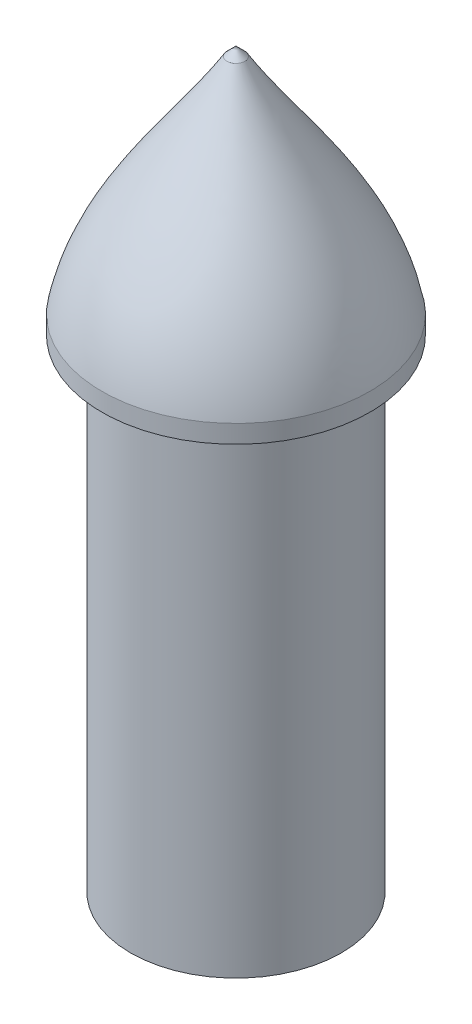
ISO-10303-21;
HEADER;
FILE_DESCRIPTION(('STEP AP214'),'2;1');
FILE_NAME('part.step','',(''),(''),'','','');
FILE_SCHEMA(('AUTOMOTIVE_DESIGN { 1 0 10303 214 1 1 1 1 }'));
ENDSEC;
DATA;
#1=APPLICATION_CONTEXT('core data for automotive mechanical design processes');
#2=APPLICATION_PROTOCOL_DEFINITION('international standard','automotive_design',2000,#1);
#3=PRODUCT_CONTEXT('',#1,'mechanical');
#4=PRODUCT('Part','Part','',(#3));
#5=PRODUCT_RELATED_PRODUCT_CATEGORY('part','',(#4));
#6=PRODUCT_DEFINITION_FORMATION('','',#4);
#7=PRODUCT_DEFINITION_CONTEXT('part definition',#1,'design');
#8=PRODUCT_DEFINITION('design','',#6,#7);
#9=PRODUCT_DEFINITION_SHAPE('','',#8);
#10=(LENGTH_UNIT() NAMED_UNIT(*) SI_UNIT(.MILLI.,.METRE.));
#11=(NAMED_UNIT(*) PLANE_ANGLE_UNIT() SI_UNIT($,.RADIAN.));
#12=(NAMED_UNIT(*) SI_UNIT($,.STERADIAN.) SOLID_ANGLE_UNIT());
#13=UNCERTAINTY_MEASURE_WITH_UNIT(LENGTH_MEASURE(1.E-05),#10,'distance_accuracy_value','');
#14=(GEOMETRIC_REPRESENTATION_CONTEXT(3) GLOBAL_UNCERTAINTY_ASSIGNED_CONTEXT((#13)) GLOBAL_UNIT_ASSIGNED_CONTEXT((#10,
#11,#12)) REPRESENTATION_CONTEXT('',''));
#15=CARTESIAN_POINT('',(0.,0.,0.));
#16=DIRECTION('',(0.,0.,1.));
#17=DIRECTION('',(1.,0.,0.));
#18=AXIS2_PLACEMENT_3D('',#15,#16,#17);
#19=CARTESIAN_POINT('',(-2.,0.,0.));
#20=DIRECTION('',(0.,1.,0.));
#21=DIRECTION('',(0.,0.,1.));
#22=AXIS2_PLACEMENT_3D('',#19,#20,#21);
#23=PLANE('',#22);
#24=CARTESIAN_POINT('',(0.,0.,0.));
#25=DIRECTION('',(0.,1.,0.));
#26=DIRECTION('',(0.,0.,1.));
#27=AXIS2_PLACEMENT_3D('',#24,#25,#26);
#28=CIRCLE('',#27,3.45);
#29=CARTESIAN_POINT('',(0.,0.,3.45));
#30=VERTEX_POINT('',#29);
#31=EDGE_CURVE('E11',#30,#30,#28,.T.);
#32=ORIENTED_EDGE('',*,*,#31,.T.);
#33=EDGE_LOOP('',(#32));
#34=FACE_BOUND('',#33,.T.);
#35=CARTESIAN_POINT('',(0.,0.,0.));
#36=DIRECTION('',(0.,-1.,0.));
#37=DIRECTION('',(0.,0.,-1.));
#38=AXIS2_PLACEMENT_3D('',#35,#36,#37);
#39=CIRCLE('',#38,3.75);
#40=CARTESIAN_POINT('',(0.,0.,-3.75));
#41=VERTEX_POINT('',#40);
#42=EDGE_CURVE('E56',#41,#41,#39,.T.);
#43=ORIENTED_EDGE('',*,*,#42,.T.);
#44=EDGE_LOOP('',(#43));
#45=FACE_BOUND('',#44,.T.);
#46=ADVANCED_FACE('F32',(#34,#45),#23,.F.);
#47=CARTESIAN_POINT('',(0.,7.,0.));
#48=DIRECTION('',(0.,-1.,0.));
#49=DIRECTION('',(0.,0.,-1.));
#50=AXIS2_PLACEMENT_3D('',#47,#48,#49);
#51=CONICAL_SURFACE('',#50,0.,0.785398163397438);
#52=CARTESIAN_POINT('',(0.,6.75257649370923,0.));
#53=DIRECTION('',(0.,-1.,0.));
#54=DIRECTION('',(0.,0.,-1.));
#55=AXIS2_PLACEMENT_3D('',#52,#53,#54);
#56=CIRCLE('',#55,0.247423506290761);
#57=CARTESIAN_POINT('',(0.,6.75257649370923,-0.247423506290761));
#58=VERTEX_POINT('',#57);
#59=EDGE_CURVE('E101',#58,#58,#56,.T.);
#60=ORIENTED_EDGE('',*,*,#59,.F.);
#61=EDGE_LOOP('',(#60));
#62=FACE_BOUND('',#61,.T.);
#63=CARTESIAN_POINT('',(0.,7.,0.));
#64=VERTEX_POINT('',#63);
#65=VERTEX_LOOP('',#64);
#66=FACE_BOUND('',#65,.T.);
#67=ADVANCED_FACE('F85',(#62,#66),#51,.T.);
#68=CARTESIAN_POINT('',(-0.247423506290761,6.75257649370924,0.));
#69=CARTESIAN_POINT('',(-1.47977646656717,4.70886286145873,0.));
#70=CARTESIAN_POINT('',(-3.28291831914856,2.94887927020943,0.));
#71=CARTESIAN_POINT('',(-3.75,0.506327417075365,0.));
#72=B_SPLINE_CURVE_WITH_KNOTS('',3,(#68,#69,#70,#71),.UNSPECIFIED.,.F.,.F.,(4,4),(0.,1.),.UNSPECIFIED.);
#73=CARTESIAN_POINT('',(0.,-2.,0.));
#74=DIRECTION('',(0.,-1.,0.));
#75=AXIS1_PLACEMENT('',#73,#74);
#76=SURFACE_OF_REVOLUTION('',#72,#75);
#77=CARTESIAN_POINT('',(0.,0.506327417075365,0.));
#78=DIRECTION('',(0.,-1.,0.));
#79=DIRECTION('',(0.,0.,-1.));
#80=AXIS2_PLACEMENT_3D('',#77,#78,#79);
#81=CIRCLE('',#80,3.75);
#82=CARTESIAN_POINT('',(0.,0.506327417075365,-3.75));
#83=VERTEX_POINT('',#82);
#84=EDGE_CURVE('E60',#83,#83,#81,.T.);
#85=ORIENTED_EDGE('',*,*,#84,.F.);
#86=EDGE_LOOP('',(#85));
#87=FACE_BOUND('',#86,.T.);
#88=ORIENTED_EDGE('',*,*,#59,.T.);
#89=EDGE_LOOP('',(#88));
#90=FACE_BOUND('',#89,.T.);
#91=ADVANCED_FACE('F91',(#87,#90),#76,.T.);
#92=CARTESIAN_POINT('',(0.,-2.,0.));
#93=DIRECTION('',(0.,-1.,0.));
#94=DIRECTION('',(0.,0.,-1.));
#95=AXIS2_PLACEMENT_3D('',#92,#93,#94);
#96=CYLINDRICAL_SURFACE('',#95,3.75);
#97=ORIENTED_EDGE('',*,*,#42,.F.);
#98=EDGE_LOOP('',(#97));
#99=FACE_BOUND('',#98,.T.);
#100=ORIENTED_EDGE('',*,*,#84,.T.);
#101=EDGE_LOOP('',(#100));
#102=FACE_BOUND('',#101,.T.);
#103=ADVANCED_FACE('F87',(#99,#102),#96,.T.);
#104=CARTESIAN_POINT('',(0.,-13.5,0.));
#105=DIRECTION('',(0.,-1.,0.));
#106=DIRECTION('',(0.,0.,-1.));
#107=AXIS2_PLACEMENT_3D('',#104,#105,#106);
#108=PLANE('',#107);
#109=CARTESIAN_POINT('',(0.,-13.5,0.));
#110=DIRECTION('',(0.,-1.,0.));
#111=DIRECTION('',(0.,0.,-1.));
#112=AXIS2_PLACEMENT_3D('',#109,#110,#111);
#113=CIRCLE('',#112,2.95);
#114=CARTESIAN_POINT('',(0.,-13.5,-2.95));
#115=VERTEX_POINT('',#114);
#116=EDGE_CURVE('E57',#115,#115,#113,.T.);
#117=ORIENTED_EDGE('',*,*,#116,.T.);
#118=EDGE_LOOP('',(#117));
#119=FACE_BOUND('',#118,.T.);
#120=CARTESIAN_POINT('',(0.,-13.5,0.));
#121=DIRECTION('',(0.,-1.,0.));
#122=DIRECTION('',(0.,0.,-1.));
#123=AXIS2_PLACEMENT_3D('',#120,#121,#122);
#124=CIRCLE('',#123,2.1);
#125=CARTESIAN_POINT('',(0.,-13.5,-2.1));
#126=VERTEX_POINT('',#125);
#127=EDGE_CURVE('E63',#126,#126,#124,.T.);
#128=ORIENTED_EDGE('',*,*,#127,.F.);
#129=EDGE_LOOP('',(#128));
#130=FACE_BOUND('',#129,.T.);
#131=ADVANCED_FACE('F90',(#119,#130),#108,.T.);
#132=CARTESIAN_POINT('',(0.,-13.5,0.));
#133=DIRECTION('',(0.,1.,0.));
#134=DIRECTION('',(0.,0.,1.));
#135=AXIS2_PLACEMENT_3D('',#132,#133,#134);
#136=CYLINDRICAL_SURFACE('',#135,2.95);
#137=CARTESIAN_POINT('',(0.,-0.5,0.));
#138=DIRECTION('',(0.,1.,0.));
#139=DIRECTION('',(0.,0.,1.));
#140=AXIS2_PLACEMENT_3D('',#137,#138,#139);
#141=CIRCLE('',#140,2.95);
#142=CARTESIAN_POINT('',(0.,-0.5,2.95));
#143=VERTEX_POINT('',#142);
#144=EDGE_CURVE('E40',#143,#143,#141,.F.);
#145=ORIENTED_EDGE('',*,*,#144,.T.);
#146=EDGE_LOOP('',(#145));
#147=FACE_BOUND('',#146,.T.);
#148=ORIENTED_EDGE('',*,*,#116,.F.);
#149=EDGE_LOOP('',(#148));
#150=FACE_BOUND('',#149,.T.);
#151=ADVANCED_FACE('F50',(#147,#150),#136,.T.);
#152=CARTESIAN_POINT('',(-1.3422701102154,5.12713202391618,0.));
#153=CARTESIAN_POINT('',(-2.36247637520993,3.70007059615556,0.));
#154=CARTESIAN_POINT('',(-3.41006800794441,2.28396407287695,0.));
#155=CARTESIAN_POINT('',(-3.75,0.506327417075365,0.));
#156=B_SPLINE_CURVE_WITH_KNOTS('',3,(#152,#153,#154,#155),.UNSPECIFIED.,.F.,.F.,(4,4),
(0.272221527857975,1.),.UNSPECIFIED.);
#157=CARTESIAN_POINT('',(0.,-2.,0.));
#158=DIRECTION('',(0.,-1.,0.));
#159=AXIS1_PLACEMENT('',#157,#158);
#160=SURFACE_OF_REVOLUTION('',#156,#159);
#161=OFFSET_SURFACE('',#160,-1.65,.F.);
#162=CARTESIAN_POINT('',(0.,4.1675430748227,0.));
#163=VERTEX_POINT('',#162);
#164=VERTEX_LOOP('',#163);
#165=FACE_BOUND('',#164,.T.);
#166=CARTESIAN_POINT('',(0.,0.338366452187331,0.));
#167=DIRECTION('',(0.,-1.,0.));
#168=DIRECTION('',(0.,0.,-1.));
#169=AXIS2_PLACEMENT_3D('',#166,#167,#168);
#170=CIRCLE('',#169,2.1);
#171=CARTESIAN_POINT('',(0.,0.338366452187331,-2.1));
#172=VERTEX_POINT('',#171);
#173=EDGE_CURVE('E54',#172,#172,#170,.T.);
#174=ORIENTED_EDGE('',*,*,#173,.T.);
#175=EDGE_LOOP('',(#174));
#176=FACE_BOUND('',#175,.T.);
#177=ADVANCED_FACE('F46',(#165,#176),#161,.F.);
#178=CARTESIAN_POINT('',(0.,-2.,0.));
#179=DIRECTION('',(0.,-1.,0.));
#180=DIRECTION('',(0.,0.,-1.));
#181=AXIS2_PLACEMENT_3D('',#178,#179,#180);
#182=CYLINDRICAL_SURFACE('',#181,2.1);
#183=ORIENTED_EDGE('',*,*,#173,.F.);
#184=EDGE_LOOP('',(#183));
#185=FACE_BOUND('',#184,.T.);
#186=ORIENTED_EDGE('',*,*,#127,.T.);
#187=EDGE_LOOP('',(#186));
#188=FACE_BOUND('',#187,.T.);
#189=ADVANCED_FACE('F49',(#185,#188),#182,.F.);
#190=CARTESIAN_POINT('',(0.,-0.5,0.));
#191=DIRECTION('',(0.,1.,0.));
#192=DIRECTION('',(0.,0.,1.));
#193=AXIS2_PLACEMENT_3D('',#190,#191,#192);
#194=TOROIDAL_SURFACE('',#193,3.45,0.5);
#195=ORIENTED_EDGE('',*,*,#31,.F.);
#196=EDGE_LOOP('',(#195));
#197=FACE_BOUND('',#196,.T.);
#198=ORIENTED_EDGE('',*,*,#144,.F.);
#199=EDGE_LOOP('',(#198));
#200=FACE_BOUND('',#199,.T.);
#201=ADVANCED_FACE('F34',(#197,#200),#194,.F.);
#202=CLOSED_SHELL('',(#46,#67,#91,#103,#131,#151,#177,#189,#201));
#203=MANIFOLD_SOLID_BREP('B2',#202);
#204=ADVANCED_BREP_SHAPE_REPRESENTATION('',(#18,#203),#14);
#205=SHAPE_DEFINITION_REPRESENTATION(#9,#204);
ENDSEC;
END-ISO-10303-21;
